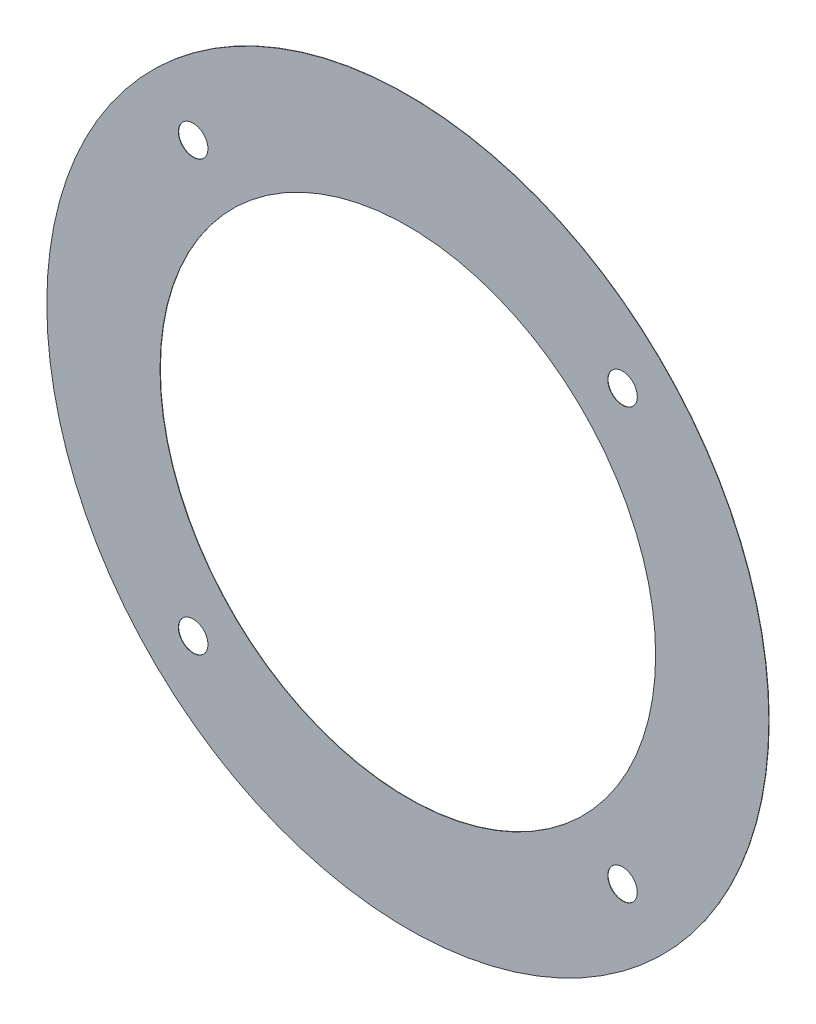
ISO-10303-21;
HEADER;
FILE_DESCRIPTION(('STEP AP214'),'2;1');
FILE_NAME('part.step','',(''),(''),'','','');
FILE_SCHEMA(('AUTOMOTIVE_DESIGN { 1 0 10303 214 1 1 1 1 }'));
ENDSEC;
DATA;
#1=APPLICATION_CONTEXT('core data for automotive mechanical design processes');
#2=APPLICATION_PROTOCOL_DEFINITION('international standard','automotive_design',2000,#1);
#3=PRODUCT_CONTEXT('',#1,'mechanical');
#4=PRODUCT('Part','Part','',(#3));
#5=PRODUCT_RELATED_PRODUCT_CATEGORY('part','',(#4));
#6=PRODUCT_DEFINITION_FORMATION('','',#4);
#7=PRODUCT_DEFINITION_CONTEXT('part definition',#1,'design');
#8=PRODUCT_DEFINITION('design','',#6,#7);
#9=PRODUCT_DEFINITION_SHAPE('','',#8);
#10=(LENGTH_UNIT() NAMED_UNIT(*) SI_UNIT(.MILLI.,.METRE.));
#11=(NAMED_UNIT(*) PLANE_ANGLE_UNIT() SI_UNIT($,.RADIAN.));
#12=(NAMED_UNIT(*) SI_UNIT($,.STERADIAN.) SOLID_ANGLE_UNIT());
#13=UNCERTAINTY_MEASURE_WITH_UNIT(LENGTH_MEASURE(1.E-05),#10,'distance_accuracy_value','');
#14=(GEOMETRIC_REPRESENTATION_CONTEXT(3) GLOBAL_UNCERTAINTY_ASSIGNED_CONTEXT((#13)) GLOBAL_UNIT_ASSIGNED_CONTEXT((#10,
#11,#12)) REPRESENTATION_CONTEXT('',''));
#15=CARTESIAN_POINT('',(0.,0.,0.));
#16=DIRECTION('',(0.,0.,1.));
#17=DIRECTION('',(1.,0.,0.));
#18=AXIS2_PLACEMENT_3D('',#15,#16,#17);
#19=CARTESIAN_POINT('',(0.,0.,0.1));
#20=DIRECTION('',(0.,0.,1.));
#21=DIRECTION('',(1.,0.,0.));
#22=AXIS2_PLACEMENT_3D('',#19,#20,#21);
#23=PLANE('',#22);
#24=CARTESIAN_POINT('',(-65.4073772597519,-65.4073772597556,0.1));
#25=DIRECTION('',(0.,0.,1.));
#26=DIRECTION('',(1.,0.,0.));
#27=AXIS2_PLACEMENT_3D('',#24,#25,#26);
#28=CIRCLE('',#27,4.50000000000195);
#29=CARTESIAN_POINT('',(-60.90737725975,-65.4073772597556,0.1));
#30=VERTEX_POINT('',#29);
#31=EDGE_CURVE('E69',#30,#30,#28,.T.);
#32=ORIENTED_EDGE('',*,*,#31,.F.);
#33=EDGE_LOOP('',(#32));
#34=FACE_BOUND('',#33,.T.);
#35=CARTESIAN_POINT('',(65.4073772597593,-65.4073772597519,0.1));
#36=DIRECTION('',(0.,0.,1.));
#37=DIRECTION('',(1.,0.,0.));
#38=AXIS2_PLACEMENT_3D('',#35,#36,#37);
#39=CIRCLE('',#38,4.50000000000516);
#40=CARTESIAN_POINT('',(69.9073772597645,-65.4073772597519,0.1));
#41=VERTEX_POINT('',#40);
#42=EDGE_CURVE('E63',#41,#41,#39,.T.);
#43=ORIENTED_EDGE('',*,*,#42,.F.);
#44=EDGE_LOOP('',(#43));
#45=FACE_BOUND('',#44,.T.);
#46=CARTESIAN_POINT('',(65.4073772597556,65.4073772597593,0.1));
#47=DIRECTION('',(0.,0.,1.));
#48=DIRECTION('',(1.,0.,0.));
#49=AXIS2_PLACEMENT_3D('',#46,#47,#48);
#50=CIRCLE('',#49,4.50000000000381);
#51=CARTESIAN_POINT('',(69.9073772597594,65.4073772597593,0.1));
#52=VERTEX_POINT('',#51);
#53=EDGE_CURVE('E57',#52,#52,#50,.T.);
#54=ORIENTED_EDGE('',*,*,#53,.F.);
#55=EDGE_LOOP('',(#54));
#56=FACE_BOUND('',#55,.T.);
#57=CARTESIAN_POINT('',(-65.4073772597556,65.4073772597556,0.1));
#58=DIRECTION('',(0.,0.,1.));
#59=DIRECTION('',(1.,0.,0.));
#60=AXIS2_PLACEMENT_3D('',#57,#58,#59);
#61=CIRCLE('',#60,4.5);
#62=CARTESIAN_POINT('',(-60.9073772597556,65.4073772597556,0.1));
#63=VERTEX_POINT('',#62);
#64=EDGE_CURVE('E51',#63,#63,#61,.T.);
#65=ORIENTED_EDGE('',*,*,#64,.F.);
#66=EDGE_LOOP('',(#65));
#67=FACE_BOUND('',#66,.T.);
#68=CARTESIAN_POINT('',(0.,0.,0.1));
#69=DIRECTION('',(0.,0.,1.));
#70=DIRECTION('',(1.,0.,0.));
#71=AXIS2_PLACEMENT_3D('',#68,#69,#70);
#72=CIRCLE('',#71,110.);
#73=CARTESIAN_POINT('',(110.,0.,0.1));
#74=VERTEX_POINT('',#73);
#75=EDGE_CURVE('E10',#74,#74,#72,.T.);
#76=ORIENTED_EDGE('',*,*,#75,.T.);
#77=EDGE_LOOP('',(#76));
#78=FACE_BOUND('',#77,.T.);
#79=CARTESIAN_POINT('',(0.,0.,0.1));
#80=DIRECTION('',(0.,0.,1.));
#81=DIRECTION('',(1.,0.,0.));
#82=AXIS2_PLACEMENT_3D('',#79,#80,#81);
#83=CIRCLE('',#82,75.5);
#84=CARTESIAN_POINT('',(75.5,0.,0.1));
#85=VERTEX_POINT('',#84);
#86=EDGE_CURVE('E43',#85,#85,#83,.T.);
#87=ORIENTED_EDGE('',*,*,#86,.F.);
#88=EDGE_LOOP('',(#87));
#89=FACE_BOUND('',#88,.T.);
#90=ADVANCED_FACE('F32',(#34,#45,#56,#67,#78,#89),#23,.T.);
#91=CARTESIAN_POINT('',(0.,0.,0.));
#92=DIRECTION('',(0.,0.,1.));
#93=DIRECTION('',(1.,0.,0.));
#94=AXIS2_PLACEMENT_3D('',#91,#92,#93);
#95=PLANE('',#94);
#96=CARTESIAN_POINT('',(-65.4073772597519,-65.4073772597556,0.));
#97=DIRECTION('',(0.,0.,1.));
#98=DIRECTION('',(1.,0.,0.));
#99=AXIS2_PLACEMENT_3D('',#96,#97,#98);
#100=CIRCLE('',#99,4.50000000000195);
#101=CARTESIAN_POINT('',(-60.90737725975,-65.4073772597556,0.));
#102=VERTEX_POINT('',#101);
#103=EDGE_CURVE('E66',#102,#102,#100,.T.);
#104=ORIENTED_EDGE('',*,*,#103,.T.);
#105=EDGE_LOOP('',(#104));
#106=FACE_BOUND('',#105,.T.);
#107=CARTESIAN_POINT('',(65.4073772597593,-65.4073772597519,0.));
#108=DIRECTION('',(0.,0.,1.));
#109=DIRECTION('',(1.,0.,0.));
#110=AXIS2_PLACEMENT_3D('',#107,#108,#109);
#111=CIRCLE('',#110,4.50000000000516);
#112=CARTESIAN_POINT('',(69.9073772597645,-65.4073772597519,0.));
#113=VERTEX_POINT('',#112);
#114=EDGE_CURVE('E60',#113,#113,#111,.T.);
#115=ORIENTED_EDGE('',*,*,#114,.T.);
#116=EDGE_LOOP('',(#115));
#117=FACE_BOUND('',#116,.T.);
#118=CARTESIAN_POINT('',(65.4073772597556,65.4073772597593,0.));
#119=DIRECTION('',(0.,0.,1.));
#120=DIRECTION('',(1.,0.,0.));
#121=AXIS2_PLACEMENT_3D('',#118,#119,#120);
#122=CIRCLE('',#121,4.50000000000381);
#123=CARTESIAN_POINT('',(69.9073772597594,65.4073772597593,0.));
#124=VERTEX_POINT('',#123);
#125=EDGE_CURVE('E54',#124,#124,#122,.T.);
#126=ORIENTED_EDGE('',*,*,#125,.T.);
#127=EDGE_LOOP('',(#126));
#128=FACE_BOUND('',#127,.T.);
#129=CARTESIAN_POINT('',(-65.4073772597556,65.4073772597556,0.));
#130=DIRECTION('',(0.,0.,1.));
#131=DIRECTION('',(1.,0.,0.));
#132=AXIS2_PLACEMENT_3D('',#129,#130,#131);
#133=CIRCLE('',#132,4.5);
#134=CARTESIAN_POINT('',(-60.9073772597556,65.4073772597556,0.));
#135=VERTEX_POINT('',#134);
#136=EDGE_CURVE('E48',#135,#135,#133,.T.);
#137=ORIENTED_EDGE('',*,*,#136,.T.);
#138=EDGE_LOOP('',(#137));
#139=FACE_BOUND('',#138,.T.);
#140=CARTESIAN_POINT('',(0.,0.,0.));
#141=DIRECTION('',(0.,0.,1.));
#142=DIRECTION('',(1.,0.,0.));
#143=AXIS2_PLACEMENT_3D('',#140,#141,#142);
#144=CIRCLE('',#143,110.);
#145=CARTESIAN_POINT('',(110.,0.,0.));
#146=VERTEX_POINT('',#145);
#147=EDGE_CURVE('E36',#146,#146,#144,.T.);
#148=ORIENTED_EDGE('',*,*,#147,.F.);
#149=EDGE_LOOP('',(#148));
#150=FACE_BOUND('',#149,.T.);
#151=CARTESIAN_POINT('',(0.,0.,0.));
#152=DIRECTION('',(0.,0.,1.));
#153=DIRECTION('',(1.,0.,0.));
#154=AXIS2_PLACEMENT_3D('',#151,#152,#153);
#155=CIRCLE('',#154,75.5);
#156=CARTESIAN_POINT('',(75.5,0.,0.));
#157=VERTEX_POINT('',#156);
#158=EDGE_CURVE('E45',#157,#157,#155,.T.);
#159=ORIENTED_EDGE('',*,*,#158,.T.);
#160=EDGE_LOOP('',(#159));
#161=FACE_BOUND('',#160,.T.);
#162=ADVANCED_FACE('F75',(#106,#117,#128,#139,#150,#161),#95,.F.);
#163=CARTESIAN_POINT('',(0.,0.,0.1));
#164=DIRECTION('',(0.,0.,-1.));
#165=DIRECTION('',(-1.,0.,0.));
#166=AXIS2_PLACEMENT_3D('',#163,#164,#165);
#167=CYLINDRICAL_SURFACE('',#166,110.);
#168=ORIENTED_EDGE('',*,*,#75,.F.);
#169=EDGE_LOOP('',(#168));
#170=FACE_BOUND('',#169,.T.);
#171=ORIENTED_EDGE('',*,*,#147,.T.);
#172=EDGE_LOOP('',(#171));
#173=FACE_BOUND('',#172,.T.);
#174=ADVANCED_FACE('F34',(#170,#173),#167,.T.);
#175=CARTESIAN_POINT('',(0.,0.,0.1));
#176=DIRECTION('',(0.,0.,-1.));
#177=DIRECTION('',(-1.,0.,0.));
#178=AXIS2_PLACEMENT_3D('',#175,#176,#177);
#179=CYLINDRICAL_SURFACE('',#178,75.5);
#180=ORIENTED_EDGE('',*,*,#86,.T.);
#181=EDGE_LOOP('',(#180));
#182=FACE_BOUND('',#181,.T.);
#183=ORIENTED_EDGE('',*,*,#158,.F.);
#184=EDGE_LOOP('',(#183));
#185=FACE_BOUND('',#184,.T.);
#186=ADVANCED_FACE('F96',(#182,#185),#179,.F.);
#187=CARTESIAN_POINT('',(-65.4073772597556,65.4073772597556,0.));
#188=DIRECTION('',(0.,0.,1.));
#189=DIRECTION('',(1.,0.,0.));
#190=AXIS2_PLACEMENT_3D('',#187,#188,#189);
#191=CYLINDRICAL_SURFACE('',#190,4.5);
#192=ORIENTED_EDGE('',*,*,#136,.F.);
#193=EDGE_LOOP('',(#192));
#194=FACE_BOUND('',#193,.T.);
#195=ORIENTED_EDGE('',*,*,#64,.T.);
#196=EDGE_LOOP('',(#195));
#197=FACE_BOUND('',#196,.T.);
#198=ADVANCED_FACE('F99',(#194,#197),#191,.F.);
#199=CARTESIAN_POINT('',(65.4073772597556,65.4073772597593,0.));
#200=DIRECTION('',(0.,0.,1.));
#201=DIRECTION('',(1.,0.,0.));
#202=AXIS2_PLACEMENT_3D('',#199,#200,#201);
#203=CYLINDRICAL_SURFACE('',#202,4.50000000000381);
#204=ORIENTED_EDGE('',*,*,#125,.F.);
#205=EDGE_LOOP('',(#204));
#206=FACE_BOUND('',#205,.T.);
#207=ORIENTED_EDGE('',*,*,#53,.T.);
#208=EDGE_LOOP('',(#207));
#209=FACE_BOUND('',#208,.T.);
#210=ADVANCED_FACE('F111',(#206,#209),#203,.F.);
#211=CARTESIAN_POINT('',(65.4073772597593,-65.4073772597519,0.));
#212=DIRECTION('',(0.,0.,1.));
#213=DIRECTION('',(1.,0.,0.));
#214=AXIS2_PLACEMENT_3D('',#211,#212,#213);
#215=CYLINDRICAL_SURFACE('',#214,4.50000000000516);
#216=ORIENTED_EDGE('',*,*,#114,.F.);
#217=EDGE_LOOP('',(#216));
#218=FACE_BOUND('',#217,.T.);
#219=ORIENTED_EDGE('',*,*,#42,.T.);
#220=EDGE_LOOP('',(#219));
#221=FACE_BOUND('',#220,.T.);
#222=ADVANCED_FACE('F81',(#218,#221),#215,.F.);
#223=CARTESIAN_POINT('',(-65.4073772597519,-65.4073772597556,0.));
#224=DIRECTION('',(0.,0.,1.));
#225=DIRECTION('',(1.,0.,0.));
#226=AXIS2_PLACEMENT_3D('',#223,#224,#225);
#227=CYLINDRICAL_SURFACE('',#226,4.50000000000195);
#228=ORIENTED_EDGE('',*,*,#103,.F.);
#229=EDGE_LOOP('',(#228));
#230=FACE_BOUND('',#229,.T.);
#231=ORIENTED_EDGE('',*,*,#31,.T.);
#232=EDGE_LOOP('',(#231));
#233=FACE_BOUND('',#232,.T.);
#234=ADVANCED_FACE('F78',(#230,#233),#227,.F.);
#235=CLOSED_SHELL('',(#90,#162,#174,#186,#198,#210,#222,#234));
#236=MANIFOLD_SOLID_BREP('B2',#235);
#237=ADVANCED_BREP_SHAPE_REPRESENTATION('',(#18,#236),#14);
#238=SHAPE_DEFINITION_REPRESENTATION(#9,#237);
ENDSEC;
END-ISO-10303-21;
